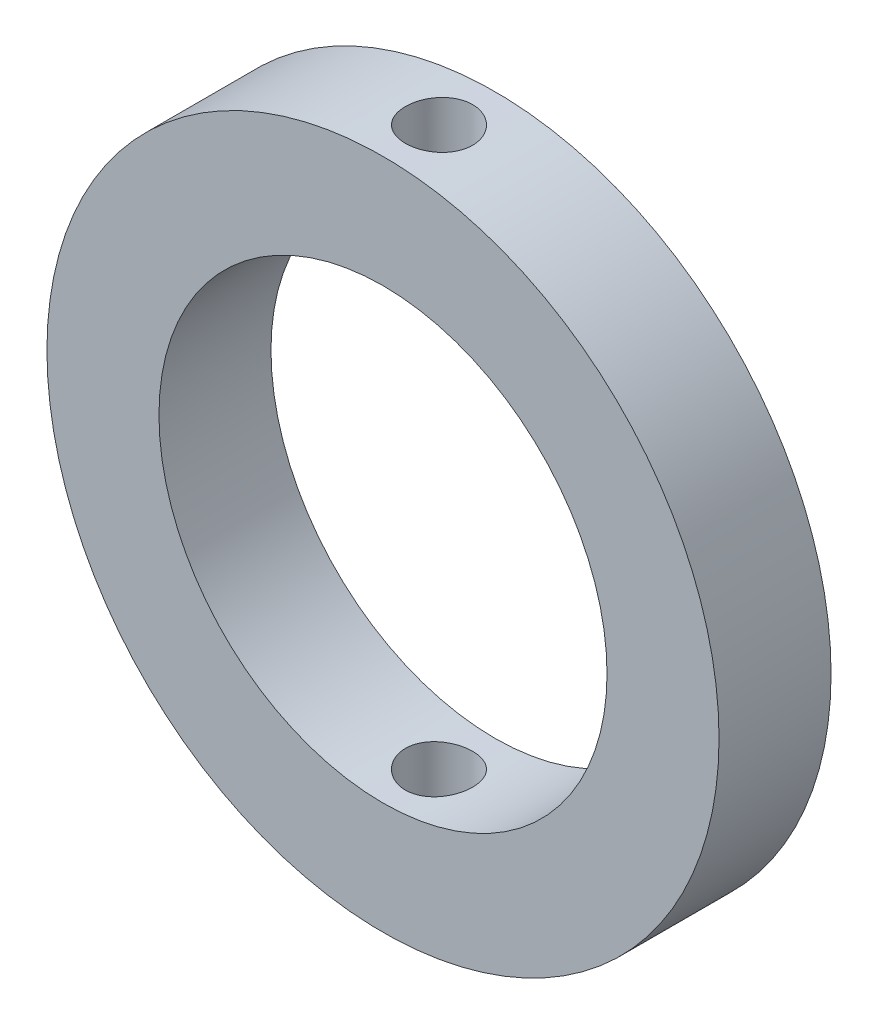
ISO-10303-21;
HEADER;
FILE_DESCRIPTION(('STEP AP214'),'2;1');
FILE_NAME('part.step','',(''),(''),'','','');
FILE_SCHEMA(('AUTOMOTIVE_DESIGN { 1 0 10303 214 1 1 1 1 }'));
ENDSEC;
DATA;
#1=APPLICATION_CONTEXT('core data for automotive mechanical design processes');
#2=APPLICATION_PROTOCOL_DEFINITION('international standard','automotive_design',2000,#1);
#3=PRODUCT_CONTEXT('',#1,'mechanical');
#4=PRODUCT('Part','Part','',(#3));
#5=PRODUCT_RELATED_PRODUCT_CATEGORY('part','',(#4));
#6=PRODUCT_DEFINITION_FORMATION('','',#4);
#7=PRODUCT_DEFINITION_CONTEXT('part definition',#1,'design');
#8=PRODUCT_DEFINITION('design','',#6,#7);
#9=PRODUCT_DEFINITION_SHAPE('','',#8);
#10=(LENGTH_UNIT() NAMED_UNIT(*) SI_UNIT(.MILLI.,.METRE.));
#11=(NAMED_UNIT(*) PLANE_ANGLE_UNIT() SI_UNIT($,.RADIAN.));
#12=(NAMED_UNIT(*) SI_UNIT($,.STERADIAN.) SOLID_ANGLE_UNIT());
#13=UNCERTAINTY_MEASURE_WITH_UNIT(LENGTH_MEASURE(1.E-05),#10,'distance_accuracy_value','');
#14=(GEOMETRIC_REPRESENTATION_CONTEXT(3) GLOBAL_UNCERTAINTY_ASSIGNED_CONTEXT((#13)) GLOBAL_UNIT_ASSIGNED_CONTEXT((#10,
#11,#12)) REPRESENTATION_CONTEXT('',''));
#15=CARTESIAN_POINT('',(0.,0.,0.));
#16=DIRECTION('',(0.,0.,1.));
#17=DIRECTION('',(1.,0.,0.));
#18=AXIS2_PLACEMENT_3D('',#15,#16,#17);
#19=CARTESIAN_POINT('',(2.2031431611579E-09,5.20104532775859E-08,6.74999818942977));
#20=DIRECTION('',(0.,0.,1.));
#21=DIRECTION('',(1.,0.,0.));
#22=AXIS2_PLACEMENT_3D('',#19,#20,#21);
#23=PLANE('',#22);
#24=CARTESIAN_POINT('',(2.2031431611579E-09,5.20104532775859E-08,6.74999818942977));
#25=DIRECTION('',(0.,0.,1.));
#26=DIRECTION('',(1.,0.,0.));
#27=AXIS2_PLACEMENT_3D('',#24,#25,#26);
#28=CIRCLE('',#27,10.5);
#29=CARTESIAN_POINT('',(10.5000000022031,5.20104532775859E-08,6.74999818942977));
#30=VERTEX_POINT('',#29);
#31=EDGE_CURVE('E10',#30,#30,#28,.T.);
#32=ORIENTED_EDGE('',*,*,#31,.T.);
#33=EDGE_LOOP('',(#32));
#34=FACE_BOUND('',#33,.T.);
#35=CARTESIAN_POINT('',(2.2031431611579E-09,5.20104532775859E-08,6.74999818942977));
#36=DIRECTION('',(0.,0.,1.));
#37=DIRECTION('',(1.,0.,0.));
#38=AXIS2_PLACEMENT_3D('',#35,#36,#37);
#39=CIRCLE('',#38,7.);
#40=CARTESIAN_POINT('',(7.00000000220314,5.20104532775859E-08,6.74999818942977));
#41=VERTEX_POINT('',#40);
#42=EDGE_CURVE('E62',#41,#41,#39,.T.);
#43=ORIENTED_EDGE('',*,*,#42,.F.);
#44=EDGE_LOOP('',(#43));
#45=FACE_BOUND('',#44,.T.);
#46=ADVANCED_FACE('F41',(#34,#45),#23,.T.);
#47=CARTESIAN_POINT('',(2.2031431611579E-09,5.20104532775859E-08,3.24999818942977));
#48=DIRECTION('',(0.,0.,1.));
#49=DIRECTION('',(1.,0.,0.));
#50=AXIS2_PLACEMENT_3D('',#47,#48,#49);
#51=PLANE('',#50);
#52=CARTESIAN_POINT('',(2.2031431611579E-09,5.20104532775859E-08,3.24999818942977));
#53=DIRECTION('',(0.,0.,1.));
#54=DIRECTION('',(1.,0.,0.));
#55=AXIS2_PLACEMENT_3D('',#52,#53,#54);
#56=CIRCLE('',#55,10.5);
#57=CARTESIAN_POINT('',(10.5000000022031,5.20104532775859E-08,3.24999818942977));
#58=VERTEX_POINT('',#57);
#59=EDGE_CURVE('E56',#58,#58,#56,.T.);
#60=ORIENTED_EDGE('',*,*,#59,.F.);
#61=EDGE_LOOP('',(#60));
#62=FACE_BOUND('',#61,.T.);
#63=CARTESIAN_POINT('',(2.2031431611579E-09,5.20104532775859E-08,3.24999818942977));
#64=DIRECTION('',(0.,0.,1.));
#65=DIRECTION('',(1.,0.,0.));
#66=AXIS2_PLACEMENT_3D('',#63,#64,#65);
#67=CIRCLE('',#66,7.);
#68=CARTESIAN_POINT('',(7.00000000220314,5.20104532775859E-08,3.24999818942977));
#69=VERTEX_POINT('',#68);
#70=EDGE_CURVE('E65',#69,#69,#67,.T.);
#71=ORIENTED_EDGE('',*,*,#70,.T.);
#72=EDGE_LOOP('',(#71));
#73=FACE_BOUND('',#72,.T.);
#74=ADVANCED_FACE('F106',(#62,#73),#51,.F.);
#75=CARTESIAN_POINT('',(2.2031431611579E-09,5.20104532775859E-08,6.74999818942977));
#76=DIRECTION('',(0.,0.,-1.));
#77=DIRECTION('',(-1.,0.,0.));
#78=AXIS2_PLACEMENT_3D('',#75,#76,#77);
#79=CYLINDRICAL_SURFACE('',#78,10.5);
#80=CARTESIAN_POINT('',(2.2031431611579E-09,-10.4999999479895,6.04999818942977));
#81=CARTESIAN_POINT('',(0.0588213736842783,-10.4999992709576,6.04999564223437));
#82=CARTESIAN_POINT('',(0.117681634629305,-10.4995004167497,6.0450387570885));
#83=CARTESIAN_POINT('',(0.233770320624822,-10.4975583577343,6.02533960062482));
#84=CARTESIAN_POINT('',(0.290996875330412,-10.4961141125468,6.01058654860395));
#85=CARTESIAN_POINT('',(0.402120261429228,-10.4924443009018,5.97172883680204));
#86=CARTESIAN_POINT('',(0.456019081048799,-10.490219206397,5.94762982488537));
#87=CARTESIAN_POINT('',(0.558994971211571,-10.4852365006298,5.89077523610154));
#88=CARTESIAN_POINT('',(0.608072997921174,-10.4824789952899,5.85802138062962));
#89=CARTESIAN_POINT('',(0.700202530410929,-10.4767292635734,5.78466035688438));
#90=CARTESIAN_POINT('',(0.74323425427978,-10.4737363145151,5.74402840005763));
#91=CARTESIAN_POINT('',(0.821879649705677,-10.4678589955053,5.65611742845359));
#92=CARTESIAN_POINT('',(0.857492978139929,-10.4649746305812,5.60883810638526));
#93=CARTESIAN_POINT('',(0.920360671168941,-10.4596336592938,5.50885073116197));
#94=CARTESIAN_POINT('',(0.947597140930767,-10.457177973454,5.45613137313017));
#95=CARTESIAN_POINT('',(0.992823706183041,-10.4529813422281,5.34683882422954));
#96=CARTESIAN_POINT('',(1.010814030124,-10.4512403791829,5.29026572861662));
#97=CARTESIAN_POINT('',(1.03697899588513,-10.4486768307558,5.17507329852046));
#98=CARTESIAN_POINT('',(1.04518643785713,-10.4478511771696,5.11646148373495));
#99=CARTESIAN_POINT('',(1.05165405159527,-10.4472022001251,4.9986868828642));
#100=CARTESIAN_POINT('',(1.04991448481748,-10.4473788503214,4.93952411130161));
#101=CARTESIAN_POINT('',(1.03656449646846,-10.4487117204284,4.82255311425178));
#102=CARTESIAN_POINT('',(1.02498988853392,-10.4498643861914,4.76474075513464));
#103=CARTESIAN_POINT('',(0.992354103561259,-10.4530138580074,4.65188332806862));
#104=CARTESIAN_POINT('',(0.971292798371677,-10.4550106754637,4.59683829751349));
#105=CARTESIAN_POINT('',(0.920241940778726,-10.4596275472363,4.49096492276594));
#106=CARTESIAN_POINT('',(0.890236499059121,-10.4622487090252,4.44014429046599));
#107=CARTESIAN_POINT('',(0.822160530924032,-10.4678179911848,4.34424671377229));
#108=CARTESIAN_POINT('',(0.784089768456474,-10.4707661211238,4.29916993754892));
#109=CARTESIAN_POINT('',(0.700763820235816,-10.4766729937759,4.21583152574129));
#110=CARTESIAN_POINT('',(0.655477704997074,-10.479631725986,4.17760080745492));
#111=CARTESIAN_POINT('',(0.559113958027111,-10.485214153314,4.10927937487386));
#112=CARTESIAN_POINT('',(0.508036319802724,-10.4878378480562,4.07918866970547));
#113=CARTESIAN_POINT('',(0.401518013180126,-10.4924554424941,4.028002668104));
#114=CARTESIAN_POINT('',(0.346076585912541,-10.4944492323446,4.0069089403708));
#115=CARTESIAN_POINT('',(0.232414580399572,-10.4975812461243,3.97433832688243));
#116=CARTESIAN_POINT('',(0.174194085318573,-10.4987194956387,3.96286115353962));
#117=CARTESIAN_POINT('',(0.0568943562496422,-10.5000088905068,3.94988866630827));
#118=CARTESIAN_POINT('',(-0.00218011500762314,-10.5001642548008,3.94835068876465));
#119=CARTESIAN_POINT('',(-0.119745980778341,-10.4994816864359,3.95518819563097));
#120=CARTESIAN_POINT('',(-0.17823738315835,-10.4986437671965,3.96356354611081));
#121=CARTESIAN_POINT('',(-0.292853614973265,-10.4960714941511,3.98995456962242));
#122=CARTESIAN_POINT('',(-0.348983089217477,-10.494338998129,4.00795026663168));
#123=CARTESIAN_POINT('',(-0.457426535249827,-10.4901719360259,4.0530506221689));
#124=CARTESIAN_POINT('',(-0.50974042146183,-10.4877373542047,4.08015548492114));
#125=CARTESIAN_POINT('',(-0.609260586977606,-10.482427938959,4.14281057002688));
#126=CARTESIAN_POINT('',(-0.65644914053322,-10.4795516558257,4.17838882280188));
#127=CARTESIAN_POINT('',(-0.744199702274329,-10.4736862431195,4.25694056055774));
#128=CARTESIAN_POINT('',(-0.784761544088493,-10.4706971107157,4.2999142311536));
#129=CARTESIAN_POINT('',(-0.85825541317836,-10.4649302014675,4.39222309282172));
#130=CARTESIAN_POINT('',(-0.891159440410377,-10.4621532244488,4.44158063379952));
#131=CARTESIAN_POINT('',(-0.948211169477875,-10.4571371888289,4.54514591758379));
#132=CARTESIAN_POINT('',(-0.972358991053433,-10.4548981228719,4.59935359405259));
#133=CARTESIAN_POINT('',(-1.01116596691556,-10.4512163981471,4.71098436586885));
#134=CARTESIAN_POINT('',(-1.02584178134931,-10.4497723417123,4.76840162152545));
#135=CARTESIAN_POINT('',(-1.04534220528279,-10.4478397834597,4.88490054728858));
#136=CARTESIAN_POINT('',(-1.05016709731635,-10.4473512542365,4.94398216961023));
#137=CARTESIAN_POINT('',(-1.04982479319168,-10.4473856356189,5.06185441220431));
#138=CARTESIAN_POINT('',(-1.04470158186962,-10.4479040939031,5.12064516645672));
#139=CARTESIAN_POINT('',(-1.02470072340869,-10.4498845388298,5.23652635245647));
#140=CARTESIAN_POINT('',(-1.00982306529712,-10.4513465265336,5.29361678229105));
#141=CARTESIAN_POINT('',(-0.970747768409235,-10.455048064753,5.40447640593002));
#142=CARTESIAN_POINT('',(-0.946551419354819,-10.4572875076633,5.45824605814098));
#143=CARTESIAN_POINT('',(-0.889530130453453,-10.4622918423028,5.56096792568435));
#144=CARTESIAN_POINT('',(-0.856705238925042,-10.4650567310895,5.60992016799143));
#145=CARTESIAN_POINT('',(-0.783193481896455,-10.4708150636914,5.7018430476253));
#146=CARTESIAN_POINT('',(-0.742473844131639,-10.4738094276204,5.74478741961521));
#147=CARTESIAN_POINT('',(-0.654393281983222,-10.4796809226418,5.82325303376441));
#148=CARTESIAN_POINT('',(-0.607030769110526,-10.4825580254808,5.8587724953548));
#149=CARTESIAN_POINT('',(-0.50687850366621,-10.4878783497157,5.92145031597712));
#150=CARTESIAN_POINT('',(-0.454075384610958,-10.4903204602711,5.94858739492221));
#151=CARTESIAN_POINT('',(-0.344671190852435,-10.4944835551135,5.99357373339483));
#152=CARTESIAN_POINT('',(-0.288074480113746,-10.4962053520409,6.01143346493099));
#153=CARTESIAN_POINT('',(-0.192631172272846,-10.4983011926137,6.03290483736881));
#154=CARTESIAN_POINT('',(-0.154394678283591,-10.4989352552538,6.0393060859441));
#155=CARTESIAN_POINT('',(-0.0774444076550355,-10.4997848549728,6.04785359179462));
#156=CARTESIAN_POINT('',(-0.0387306329847426,-10.5000003937778,6.04999986661772));
#157=CARTESIAN_POINT('',(2.2031431611579E-09,-10.4999999479895,6.04999818942977));
#158=B_SPLINE_CURVE_WITH_KNOTS('',3,(#80,#81,#82,#83,#84,#85,#86,#87,#88,#89,#90,#91,#92,#93,
#94,#95,#96,#97,#98,#99,#100,#101,#102,#103,#104,#105,#106,#107,#108,#109,#110,#111,#112,#113,
#114,#115,#116,#117,#118,#119,#120,#121,#122,#123,#124,#125,#126,#127,#128,#129,#130,#131,#132,
#133,#134,#135,#136,#137,#138,#139,#140,#141,#142,#143,#144,#145,#146,#147,#148,#149,#150,#151,
#152,#153,#154,#155,#156,#157),.UNSPECIFIED.,.T.,.F.,(4,2,2,2,2,2,2,2,2,2,2,2,2,2,2,2,2,2,2,2,2,
2,2,2,2,2,2,2,2,2,2,2,2,2,2,2,2,2,4),(0.,0.176322684581897,0.352839734977261,0.529250280018813,
0.705625764461921,0.882565497054092,1.05951341181741,1.23683674245833,1.41415569164629,
1.59087843647456,1.76759653618565,1.94367387313166,2.11975358869715,2.29614799441539,
2.47254756347682,2.64972470906017,2.8269020532876,3.0041102772826,3.18131320159211,
3.35775498038145,3.534194375451,3.7102688205902,3.8863472135194,4.06301637786133,
4.23968997700741,4.41699975789028,4.59430711399143,4.77130175122653,4.94829131201564,
5.12450010758654,5.30070910137341,5.4768937163094,5.65307734465908,5.83000863299036,
6.00698230268805,6.18440162577554,6.3616202453506,6.47771950593966,6.59381828772478),.UNSPECIFIED.);
#159=CARTESIAN_POINT('',(2.2031431611579E-09,-10.4999999479895,6.04999818942977));
#160=VERTEX_POINT('',#159);
#161=EDGE_CURVE('E92',#160,#160,#158,.T.);
#162=ORIENTED_EDGE('',*,*,#161,.T.);
#163=EDGE_LOOP('',(#162));
#164=FACE_BOUND('',#163,.T.);
#165=CARTESIAN_POINT('',(2.2031431611579E-09,10.5000000520105,6.04999818942977));
#166=CARTESIAN_POINT('',(-0.058821369277992,10.4999993749785,6.04999564223437));
#167=CARTESIAN_POINT('',(-0.117681630223019,10.4995005207706,6.0450387570885));
#168=CARTESIAN_POINT('',(-0.233770316218536,10.4975584617552,6.02533960062482));
#169=CARTESIAN_POINT('',(-0.290996870924126,10.4961142165677,6.01058654860395));
#170=CARTESIAN_POINT('',(-0.402120257022942,10.4924444049227,5.97172883680204));
#171=CARTESIAN_POINT('',(-0.456019076642512,10.4902193104179,5.94762982488537));
#172=CARTESIAN_POINT('',(-0.558994966805284,10.4852366046507,5.89077523610154));
#173=CARTESIAN_POINT('',(-0.608072993514887,10.4824790993108,5.85802138062962));
#174=CARTESIAN_POINT('',(-0.700202526004643,10.4767293675944,5.78466035688438));
#175=CARTESIAN_POINT('',(-0.743234249873494,10.473736418536,5.74402840005763));
#176=CARTESIAN_POINT('',(-0.82187964529939,10.4678590995262,5.65611742845359));
#177=CARTESIAN_POINT('',(-0.857492973733642,10.4649747346021,5.60883810638526));
#178=CARTESIAN_POINT('',(-0.920360666762654,10.4596337633147,5.50885073116197));
#179=CARTESIAN_POINT('',(-0.94759713652448,10.457178077475,5.45613137313017));
#180=CARTESIAN_POINT('',(-0.992823701776754,10.452981446249,5.34683882422954));
#181=CARTESIAN_POINT('',(-1.01081402571771,10.4512404832038,5.29026572861662));
#182=CARTESIAN_POINT('',(-1.03697899147884,10.4486769347767,5.17507329852046));
#183=CARTESIAN_POINT('',(-1.04518643345084,10.4478512811905,5.11646148373495));
#184=CARTESIAN_POINT('',(-1.05165404718899,10.447202304146,4.9986868828642));
#185=CARTESIAN_POINT('',(-1.0499144804112,10.4473789543423,4.93952411130161));
#186=CARTESIAN_POINT('',(-1.03656449206217,10.4487118244493,4.82255311425179));
#187=CARTESIAN_POINT('',(-1.02498988412764,10.4498644902123,4.76474075513464));
#188=CARTESIAN_POINT('',(-0.992354099154972,10.4530139620283,4.65188332806862));
#189=CARTESIAN_POINT('',(-0.97129279396539,10.4550107794846,4.59683829751349));
#190=CARTESIAN_POINT('',(-0.920241936372439,10.4596276512572,4.49096492276594));
#191=CARTESIAN_POINT('',(-0.890236494652835,10.4622488130461,4.44014429046599));
#192=CARTESIAN_POINT('',(-0.822160526517745,10.4678180952057,4.34424671377229));
#193=CARTESIAN_POINT('',(-0.784089764050187,10.4707662251447,4.29916993754892));
#194=CARTESIAN_POINT('',(-0.700763815829529,10.4766730977968,4.21583152574129));
#195=CARTESIAN_POINT('',(-0.655477700590788,10.4796318300069,4.17760080745492));
#196=CARTESIAN_POINT('',(-0.559113953620824,10.4852142573349,4.10927937487386));
#197=CARTESIAN_POINT('',(-0.508036315396437,10.4878379520771,4.07918866970547));
#198=CARTESIAN_POINT('',(-0.40151800877384,10.492455546515,4.028002668104));
#199=CARTESIAN_POINT('',(-0.346076581506255,10.4944493363655,4.0069089403708));
#200=CARTESIAN_POINT('',(-0.232414575993285,10.4975813501452,3.97433832688243));
#201=CARTESIAN_POINT('',(-0.174194080912287,10.4987195996596,3.96286115353962));
#202=CARTESIAN_POINT('',(-0.0568943518433558,10.5000089945277,3.94988866630827));
#203=CARTESIAN_POINT('',(0.00218011941390962,10.5001643588217,3.94835068876465));
#204=CARTESIAN_POINT('',(0.119745985184628,10.4994817904568,3.95518819563097));
#205=CARTESIAN_POINT('',(0.178237387564637,10.4986438712174,3.96356354611081));
#206=CARTESIAN_POINT('',(0.292853619379551,10.496071598172,3.98995456962242));
#207=CARTESIAN_POINT('',(0.348983093623763,10.4943391021499,4.00795026663168));
#208=CARTESIAN_POINT('',(0.457426539656114,10.4901720400468,4.0530506221689));
#209=CARTESIAN_POINT('',(0.509740425868116,10.4877374582256,4.08015548492114));
#210=CARTESIAN_POINT('',(0.609260591383892,10.4824280429799,4.14281057002688));
#211=CARTESIAN_POINT('',(0.656449144939506,10.4795517598466,4.17838882280188));
#212=CARTESIAN_POINT('',(0.744199706680615,10.4736863471404,4.25694056055774));
#213=CARTESIAN_POINT('',(0.784761548494779,10.4706972147367,4.2999142311536));
#214=CARTESIAN_POINT('',(0.858255417584646,10.4649303054884,4.39222309282172));
#215=CARTESIAN_POINT('',(0.891159444816663,10.4621533284697,4.44158063379952));
#216=CARTESIAN_POINT('',(0.948211173884162,10.4571372928498,4.54514591758379));
#217=CARTESIAN_POINT('',(0.972358995459719,10.4548982268928,4.59935359405259));
#218=CARTESIAN_POINT('',(1.01116597132184,10.451216502168,4.71098436586885));
#219=CARTESIAN_POINT('',(1.0258417857556,10.4497724457332,4.76840162152545));
#220=CARTESIAN_POINT('',(1.04534220968908,10.4478398874807,4.88490054728858));
#221=CARTESIAN_POINT('',(1.05016710172264,10.4473513582574,4.94398216961023));
#222=CARTESIAN_POINT('',(1.04982479759796,10.4473857396399,5.06185441220431));
#223=CARTESIAN_POINT('',(1.04470158627591,10.447904197924,5.12064516645672));
#224=CARTESIAN_POINT('',(1.02470072781498,10.4498846428507,5.23652635245647));
#225=CARTESIAN_POINT('',(1.00982306970341,10.4513466305545,5.29361678229105));
#226=CARTESIAN_POINT('',(0.970747772815521,10.4550481687739,5.40447640593002));
#227=CARTESIAN_POINT('',(0.946551423761105,10.4572876116842,5.45824605814098));
#228=CARTESIAN_POINT('',(0.88953013485974,10.4622919463237,5.56096792568435));
#229=CARTESIAN_POINT('',(0.856705243331329,10.4650568351104,5.60992016799143));
#230=CARTESIAN_POINT('',(0.783193486302741,10.4708151677123,5.7018430476253));
#231=CARTESIAN_POINT('',(0.742473848537925,10.4738095316413,5.74478741961521));
#232=CARTESIAN_POINT('',(0.654393286389508,10.4796810266627,5.82325303376441));
#233=CARTESIAN_POINT('',(0.607030773516813,10.4825581295017,5.8587724953548));
#234=CARTESIAN_POINT('',(0.506878508072497,10.4878784537366,5.92145031597712));
#235=CARTESIAN_POINT('',(0.454075389017245,10.490320564292,5.94858739492221));
#236=CARTESIAN_POINT('',(0.344671195258721,10.4944836591344,5.99357373339483));
#237=CARTESIAN_POINT('',(0.288074484520033,10.4962054560618,6.01143346493099));
#238=CARTESIAN_POINT('',(0.192631176679133,10.4983012966347,6.03290483736881));
#239=CARTESIAN_POINT('',(0.154394682689877,10.4989353592747,6.0393060859441));
#240=CARTESIAN_POINT('',(0.0774444120613218,10.4997849589937,6.04785359179462));
#241=CARTESIAN_POINT('',(0.0387306373910289,10.5000004977987,6.04999986661772));
#242=CARTESIAN_POINT('',(2.2031431611579E-09,10.5000000520105,6.04999818942977));
#243=B_SPLINE_CURVE_WITH_KNOTS('',3,(#165,#166,#167,#168,#169,#170,#171,#172,#173,#174,#175,
#176,#177,#178,#179,#180,#181,#182,#183,#184,#185,#186,#187,#188,#189,#190,#191,#192,#193,#194,
#195,#196,#197,#198,#199,#200,#201,#202,#203,#204,#205,#206,#207,#208,#209,#210,#211,#212,#213,
#214,#215,#216,#217,#218,#219,#220,#221,#222,#223,#224,#225,#226,#227,#228,#229,#230,#231,#232,
#233,#234,#235,#236,#237,#238,#239,#240,#241,#242),.UNSPECIFIED.,.T.,.F.,(4,2,2,2,2,2,2,2,2,2,2,
2,2,2,2,2,2,2,2,2,2,2,2,2,2,2,2,2,2,2,2,2,2,2,2,2,2,2,4),(0.,0.176322684581897,
0.352839734977261,0.529250280018813,0.705625764461921,0.882565497054092,1.05951341181741,
1.23683674245833,1.41415569164629,1.59087843647456,1.76759653618565,1.94367387313166,
2.11975358869715,2.29614799441539,2.47254756347682,2.64972470906017,2.8269020532876,
3.0041102772826,3.18131320159211,3.35775498038145,3.534194375451,3.7102688205902,
3.8863472135194,4.06301637786133,4.23968997700741,4.41699975789028,4.59430711399143,
4.77130175122653,4.94829131201564,5.12450010758654,5.30070910137341,5.4768937163094,
5.65307734465908,5.83000863299036,6.00698230268805,6.18440162577554,6.3616202453506,
6.47771950593966,6.59381828772478),.UNSPECIFIED.);
#244=CARTESIAN_POINT('',(2.2031431611579E-09,10.5000000520105,6.04999818942977));
#245=VERTEX_POINT('',#244);
#246=EDGE_CURVE('E86',#245,#245,#243,.T.);
#247=ORIENTED_EDGE('',*,*,#246,.T.);
#248=EDGE_LOOP('',(#247));
#249=FACE_BOUND('',#248,.T.);
#250=ORIENTED_EDGE('',*,*,#31,.F.);
#251=EDGE_LOOP('',(#250));
#252=FACE_BOUND('',#251,.T.);
#253=ORIENTED_EDGE('',*,*,#59,.T.);
#254=EDGE_LOOP('',(#253));
#255=FACE_BOUND('',#254,.T.);
#256=ADVANCED_FACE('F43',(#164,#249,#252,#255),#79,.T.);
#257=CARTESIAN_POINT('',(2.2031431611579E-09,5.20104532775859E-08,6.74999818942977));
#258=DIRECTION('',(0.,0.,-1.));
#259=DIRECTION('',(-1.,0.,0.));
#260=AXIS2_PLACEMENT_3D('',#257,#258,#259);
#261=CYLINDRICAL_SURFACE('',#260,7.);
#262=CARTESIAN_POINT('',(2.2031431611579E-09,-6.99999994798955,6.04999818942977));
#263=CARTESIAN_POINT('',(0.0586260833402927,-6.99999900838863,6.0499957717591));
#264=CARTESIAN_POINT('',(0.117286181760636,-6.99925572574883,6.04507158884133));
#265=CARTESIAN_POINT('',(0.232966741799582,-6.99636215980185,6.02550994944184));
#266=CARTESIAN_POINT('',(0.289985550485103,-6.99421050655886,6.01086303536834));
#267=CARTESIAN_POINT('',(0.400692662558445,-6.98874199652622,5.97230343595243));
#268=CARTESIAN_POINT('',(0.454383447681903,-6.98542602058598,5.9483977537756));
#269=CARTESIAN_POINT('',(0.556983302247821,-6.97799527937161,5.89201632383797));
#270=CARTESIAN_POINT('',(0.605893034510775,-6.97388062505896,5.85954176633762));
#271=CARTESIAN_POINT('',(0.697932705896631,-6.96527414492971,5.78667410397186));
#272=CARTESIAN_POINT('',(0.741019884760993,-6.96077988522186,5.74622727008403));
#273=CARTESIAN_POINT('',(0.819822436885782,-6.95193977592221,5.65867880720406));
#274=CARTESIAN_POINT('',(0.855537386113693,-6.94759393487908,5.6115767956848));
#275=CARTESIAN_POINT('',(0.918748108702743,-6.93951909020063,5.51176773896402));
#276=CARTESIAN_POINT('',(0.946202511463578,-6.93579323181476,5.45903421654283));
#277=CARTESIAN_POINT('',(0.991848427400536,-6.92941342713342,5.34963921497797));
#278=CARTESIAN_POINT('',(1.01004044542728,-6.92675942241769,5.29297795010905));
#279=CARTESIAN_POINT('',(1.03651239379552,-6.92284774152026,5.17778556011957));
#280=CARTESIAN_POINT('',(1.04486552768677,-6.9215797581783,5.11927161404415));
#281=CARTESIAN_POINT('',(1.05164937044067,-6.92055239078362,5.00165987323867));
#282=CARTESIAN_POINT('',(1.05008064901972,-6.92079292011158,4.94256211222602));
#283=CARTESIAN_POINT('',(1.03712513495866,-6.92274597645641,4.82597743329387));
#284=CARTESIAN_POINT('',(1.0258198736974,-6.92444627932039,4.76848122089041));
#285=CARTESIAN_POINT('',(0.993839824029282,-6.92910820487412,4.6562111312197));
#286=CARTESIAN_POINT('',(0.973164770567827,-6.9320698632452,4.60143733101325));
#287=CARTESIAN_POINT('',(0.922947226911298,-6.93893429680791,4.49591882953177));
#288=CARTESIAN_POINT('',(0.893370202185527,-6.94284072535523,4.4451908110651));
#289=CARTESIAN_POINT('',(0.826212894105826,-6.95115190101138,4.34938697238242));
#290=CARTESIAN_POINT('',(0.78863208548049,-6.95555668081705,4.30431152344121));
#291=CARTESIAN_POINT('',(0.706086453750877,-6.96442225938301,4.22061982691197));
#292=CARTESIAN_POINT('',(0.661051532952544,-6.96888317777925,4.18207269622933));
#293=CARTESIAN_POINT('',(0.565114965129073,-6.97731748152878,4.11307303527469));
#294=CARTESIAN_POINT('',(0.514213292414862,-6.98129086474712,4.08262054044904));
#295=CARTESIAN_POINT('',(0.407928220952723,-6.9883065570873,4.03067102888009));
#296=CARTESIAN_POINT('',(0.352542176688889,-6.99134831146754,4.00917934514156));
#297=CARTESIAN_POINT('',(0.238891229944085,-6.99615338188903,3.97582161665001));
#298=CARTESIAN_POINT('',(0.180626522369963,-6.99791678435782,3.96395492115887));
#299=CARTESIAN_POINT('',(0.0634686995536954,-6.99995501592664,3.95027592855808));
#300=CARTESIAN_POINT('',(0.00458691451247212,-7.00024391262226,3.94836860946424));
#301=CARTESIAN_POINT('',(-0.112655672160455,-6.99933887509613,3.95441029314749));
#302=CARTESIAN_POINT('',(-0.171016489864171,-6.99814498677912,3.96235899079744));
#303=CARTESIAN_POINT('',(-0.285272668998842,-6.99441722829688,3.98780805955405));
#304=CARTESIAN_POINT('',(-0.341178571952743,-6.99188985444544,4.00526213665136));
#305=CARTESIAN_POINT('',(-0.449270468846956,-6.98577759759813,4.049177687653));
#306=CARTESIAN_POINT('',(-0.501456287953427,-6.9821926649405,4.07563958456331));
#307=CARTESIAN_POINT('',(-0.601044483301201,-6.97432872527035,4.13704254662447));
#308=CARTESIAN_POINT('',(-0.648409304720952,-6.97004485937676,4.17204388743871));
#309=CARTESIAN_POINT('',(-0.73662656902125,-6.9612749890747,4.24944825756989));
#310=CARTESIAN_POINT('',(-0.777478633152239,-6.95678897292962,4.29185171705702));
#311=CARTESIAN_POINT('',(-0.851856492497225,-6.948075798121,4.38327966265331));
#312=CARTESIAN_POINT('',(-0.885318591028804,-6.94385110011266,4.43235623706611));
#313=CARTESIAN_POINT('',(-0.943523902690945,-6.93618248172387,4.53548941778801));
#314=CARTESIAN_POINT('',(-0.968267351391907,-6.93273854024894,4.5895458894948));
#315=CARTESIAN_POINT('',(-1.00823426906446,-6.92703917905006,4.70091446296596));
#316=CARTESIAN_POINT('',(-1.0234912577883,-6.92477957903461,4.75821431210964));
#317=CARTESIAN_POINT('',(-1.04415884430796,-6.92169362407416,4.87459950023434));
#318=CARTESIAN_POINT('',(-1.04957012207832,-6.92086717015194,4.93368471562604));
#319=CARTESIAN_POINT('',(-1.05037650448294,-6.92074477626544,5.05132853375082));
#320=CARTESIAN_POINT('',(-1.04587176296805,-6.92143353232406,5.10988645865961));
#321=CARTESIAN_POINT('',(-1.02718860460751,-6.92423069226776,5.22540187375623));
#322=CARTESIAN_POINT('',(-1.01301020326725,-6.92633909387737,5.28235936650914));
#323=CARTESIAN_POINT('',(-0.975417612427512,-6.93173263077563,5.3930293469938));
#324=CARTESIAN_POINT('',(-0.952010423067054,-6.93501687400207,5.44674425873318));
#325=CARTESIAN_POINT('',(-0.896634671293019,-6.94239312989346,5.54950073309145));
#326=CARTESIAN_POINT('',(-0.864665818987369,-6.94648516990861,5.59854213739232));
#327=CARTESIAN_POINT('',(-0.792710361411005,-6.95506515154411,5.69106833001239));
#328=CARTESIAN_POINT('',(-0.752649581075496,-6.95955652316331,5.73449512270272));
#329=CARTESIAN_POINT('',(-0.665804186554841,-6.968400469776,5.81404537778125));
#330=CARTESIAN_POINT('',(-0.619018011642515,-6.97275301226486,5.85016714023308));
#331=CARTESIAN_POINT('',(-0.519746993077461,-6.98085624852319,5.91425956305492));
#332=CARTESIAN_POINT('',(-0.467232201532188,-6.98460349789129,5.94218426588009));
#333=CARTESIAN_POINT('',(-0.35822630697096,-6.99104014961026,5.9887751511604));
#334=CARTESIAN_POINT('',(-0.301739391764549,-6.99373064694984,6.00745092246735));
#335=CARTESIAN_POINT('',(-0.204166007319387,-6.99713652282008,6.03077712932684));
#336=CARTESIAN_POINT('',(-0.163681791243551,-6.99820479224644,6.03797401050694));
#337=CARTESIAN_POINT('',(-0.0821372779169443,-6.99963682962481,6.04758535782862));
#338=CARTESIAN_POINT('',(-0.0410769878309488,-7.00000060633097,6.04999988339655));
#339=CARTESIAN_POINT('',(2.2031431611579E-09,-6.99999994798955,6.04999818942977));
#340=B_SPLINE_CURVE_WITH_KNOTS('',3,(#262,#263,#264,#265,#266,#267,#268,#269,#270,#271,#272,
#273,#274,#275,#276,#277,#278,#279,#280,#281,#282,#283,#284,#285,#286,#287,#288,#289,#290,#291,
#292,#293,#294,#295,#296,#297,#298,#299,#300,#301,#302,#303,#304,#305,#306,#307,#308,#309,#310,
#311,#312,#313,#314,#315,#316,#317,#318,#319,#320,#321,#322,#323,#324,#325,#326,#327,#328,#329,
#330,#331,#332,#333,#334,#335,#336,#337,#338,#339),.UNSPECIFIED.,.T.,.F.,(4,2,2,2,2,2,2,2,2,2,2,
2,2,2,2,2,2,2,2,2,2,2,2,2,2,2,2,2,2,2,2,2,2,2,2,2,2,2,4),(0.,0.175728143522164,
0.351627474050406,0.527394016508266,0.703136156938319,0.880105912957903,1.05708584500806,
1.23493791676762,1.41278029357854,1.58929095224147,1.76579147569288,1.94082824037022,
2.11586995683253,2.29159968433311,2.46734094815974,2.64484003878786,2.82233990667068,
2.99994526289412,3.17753861035381,3.35343440980979,3.52932476393808,3.70436604276163,
3.87941554263391,4.05573831625835,4.23207134020041,4.4098695660927,4.58766298766182,
4.76482456420017,4.94197390496023,5.11734221782745,5.29271024960695,5.46794551788903,
5.64318672026815,5.82011380976004,5.99708202428113,6.17502426369313,6.35278163283009,
6.47590896385166,6.59903476486303),.UNSPECIFIED.);
#341=CARTESIAN_POINT('',(2.2031431611579E-09,-6.99999994798955,6.04999818942977));
#342=VERTEX_POINT('',#341);
#343=EDGE_CURVE('E46',#342,#342,#340,.T.);
#344=ORIENTED_EDGE('',*,*,#343,.F.);
#345=EDGE_LOOP('',(#344));
#346=FACE_BOUND('',#345,.T.);
#347=CARTESIAN_POINT('',(2.2031431611579E-09,7.00000005201045,6.04999818942977));
#348=CARTESIAN_POINT('',(-0.0586260789340064,6.99999911240953,6.0499957717591));
#349=CARTESIAN_POINT('',(-0.117286177354349,6.99925582976973,6.04507158884133));
#350=CARTESIAN_POINT('',(-0.232966737393296,6.99636226382276,6.02550994944184));
#351=CARTESIAN_POINT('',(-0.289985546078817,6.99421061057976,6.01086303536834));
#352=CARTESIAN_POINT('',(-0.400692658152159,6.98874210054713,5.97230343595243));
#353=CARTESIAN_POINT('',(-0.454383443275616,6.98542612460689,5.9483977537756));
#354=CARTESIAN_POINT('',(-0.556983297841535,6.97799538339252,5.89201632383797));
#355=CARTESIAN_POINT('',(-0.605893030104489,6.97388072907986,5.85954176633762));
#356=CARTESIAN_POINT('',(-0.697932701490345,6.96527424895062,5.78667410397186));
#357=CARTESIAN_POINT('',(-0.741019880354708,6.96077998924277,5.74622727008403));
#358=CARTESIAN_POINT('',(-0.819822432479497,6.95193987994312,5.65867880720406));
#359=CARTESIAN_POINT('',(-0.855537381707406,6.94759403889999,5.6115767956848));
#360=CARTESIAN_POINT('',(-0.918748104296456,6.93951919422153,5.51176773896402));
#361=CARTESIAN_POINT('',(-0.946202507057291,6.93579333583567,5.45903421654283));
#362=CARTESIAN_POINT('',(-0.991848422994249,6.92941353115433,5.34963921497797));
#363=CARTESIAN_POINT('',(-1.010040441021,6.92675952643859,5.29297795010905));
#364=CARTESIAN_POINT('',(-1.03651238938923,6.92284784554117,5.17778556011957));
#365=CARTESIAN_POINT('',(-1.04486552328048,6.9215798621992,5.11927161404415));
#366=CARTESIAN_POINT('',(-1.05164936603438,6.92055249480453,5.00165987323867));
#367=CARTESIAN_POINT('',(-1.05008064461343,6.92079302413248,4.94256211222602));
#368=CARTESIAN_POINT('',(-1.03712513055237,6.92274608047732,4.82597743329387));
#369=CARTESIAN_POINT('',(-1.02581986929111,6.9244463833413,4.76848122089041));
#370=CARTESIAN_POINT('',(-0.993839819622996,6.92910830889502,4.6562111312197));
#371=CARTESIAN_POINT('',(-0.973164766161541,6.93206996726611,4.60143733101325));
#372=CARTESIAN_POINT('',(-0.922947222505012,6.93893440082882,4.49591882953177));
#373=CARTESIAN_POINT('',(-0.893370197779241,6.94284082937614,4.4451908110651));
#374=CARTESIAN_POINT('',(-0.82621288969954,6.95115200503229,4.34938697238242));
#375=CARTESIAN_POINT('',(-0.788632081074204,6.95555678483796,4.30431152344121));
#376=CARTESIAN_POINT('',(-0.706086449344591,6.96442236340392,4.22061982691197));
#377=CARTESIAN_POINT('',(-0.661051528546258,6.96888328180015,4.18207269622933));
#378=CARTESIAN_POINT('',(-0.565114960722787,6.97731758554968,4.11307303527469));
#379=CARTESIAN_POINT('',(-0.514213288008576,6.98129096876802,4.08262054044904));
#380=CARTESIAN_POINT('',(-0.407928216546437,6.9883066611082,4.03067102888009));
#381=CARTESIAN_POINT('',(-0.352542172282603,6.99134841548845,4.00917934514156));
#382=CARTESIAN_POINT('',(-0.238891225537799,6.99615348590994,3.97582161665001));
#383=CARTESIAN_POINT('',(-0.180626517963677,6.99791688837872,3.96395492115887));
#384=CARTESIAN_POINT('',(-0.0634686951474092,6.99995511994755,3.95027592855808));
#385=CARTESIAN_POINT('',(-0.00458691010618608,7.00024401664317,3.94836860946424));
#386=CARTESIAN_POINT('',(0.112655676566741,6.99933897911704,3.95441029314749));
#387=CARTESIAN_POINT('',(0.171016494270457,6.99814509080003,3.96235899079744));
#388=CARTESIAN_POINT('',(0.285272673405129,6.99441733231779,3.98780805955405));
#389=CARTESIAN_POINT('',(0.34117857635903,6.99188995846634,4.00526213665136));
#390=CARTESIAN_POINT('',(0.449270473253243,6.98577770161904,4.049177687653));
#391=CARTESIAN_POINT('',(0.501456292359713,6.98219276896141,4.07563958456331));
#392=CARTESIAN_POINT('',(0.601044487707488,6.97432882929126,4.13704254662447));
#393=CARTESIAN_POINT('',(0.648409309127239,6.97004496339767,4.17204388743871));
#394=CARTESIAN_POINT('',(0.736626573427537,6.96127509309561,4.24944825756989));
#395=CARTESIAN_POINT('',(0.777478637558525,6.95678907695052,4.29185171705702));
#396=CARTESIAN_POINT('',(0.851856496903511,6.94807590214191,4.38327966265331));
#397=CARTESIAN_POINT('',(0.88531859543509,6.94385120413357,4.43235623706611));
#398=CARTESIAN_POINT('',(0.943523907097231,6.93618258574478,4.53548941778801));
#399=CARTESIAN_POINT('',(0.968267355798194,6.93273864426985,4.5895458894948));
#400=CARTESIAN_POINT('',(1.00823427347075,6.92703928307097,4.70091446296596));
#401=CARTESIAN_POINT('',(1.02349126219459,6.92477968305552,4.75821431210964));
#402=CARTESIAN_POINT('',(1.04415884871425,6.92169372809507,4.87459950023434));
#403=CARTESIAN_POINT('',(1.04957012648461,6.92086727417285,4.93368471562604));
#404=CARTESIAN_POINT('',(1.05037650888922,6.92074488028634,5.05132853375082));
#405=CARTESIAN_POINT('',(1.04587176737433,6.92143363634497,5.10988645865961));
#406=CARTESIAN_POINT('',(1.02718860901379,6.92423079628867,5.22540187375623));
#407=CARTESIAN_POINT('',(1.01301020767353,6.92633919789828,5.28235936650914));
#408=CARTESIAN_POINT('',(0.975417616833798,6.93173273479653,5.3930293469938));
#409=CARTESIAN_POINT('',(0.952010427473341,6.93501697802298,5.44674425873318));
#410=CARTESIAN_POINT('',(0.896634675699305,6.94239323391436,5.54950073309145));
#411=CARTESIAN_POINT('',(0.864665823393656,6.94648527392952,5.59854213739232));
#412=CARTESIAN_POINT('',(0.792710365817291,6.95506525556502,5.69106833001239));
#413=CARTESIAN_POINT('',(0.752649585481783,6.95955662718422,5.73449512270272));
#414=CARTESIAN_POINT('',(0.665804190961127,6.96840057379691,5.81404537778125));
#415=CARTESIAN_POINT('',(0.619018016048801,6.97275311628576,5.85016714023308));
#416=CARTESIAN_POINT('',(0.519746997483748,6.9808563525441,5.91425956305492));
#417=CARTESIAN_POINT('',(0.467232205938475,6.98460360191219,5.94218426588009));
#418=CARTESIAN_POINT('',(0.358226311377246,6.99104025363117,5.9887751511604));
#419=CARTESIAN_POINT('',(0.301739396170835,6.99373075097075,6.00745092246735));
#420=CARTESIAN_POINT('',(0.204166011725673,6.99713662684099,6.03077712932684));
#421=CARTESIAN_POINT('',(0.163681795649838,6.99820489626735,6.03797401050694));
#422=CARTESIAN_POINT('',(0.0821372823232306,6.99963693364572,6.04758535782862));
#423=CARTESIAN_POINT('',(0.0410769922372351,7.00000071035188,6.04999988339655));
#424=CARTESIAN_POINT('',(2.2031431611579E-09,7.00000005201045,6.04999818942977));
#425=B_SPLINE_CURVE_WITH_KNOTS('',3,(#347,#348,#349,#350,#351,#352,#353,#354,#355,#356,#357,
#358,#359,#360,#361,#362,#363,#364,#365,#366,#367,#368,#369,#370,#371,#372,#373,#374,#375,#376,
#377,#378,#379,#380,#381,#382,#383,#384,#385,#386,#387,#388,#389,#390,#391,#392,#393,#394,#395,
#396,#397,#398,#399,#400,#401,#402,#403,#404,#405,#406,#407,#408,#409,#410,#411,#412,#413,#414,
#415,#416,#417,#418,#419,#420,#421,#422,#423,#424),.UNSPECIFIED.,.T.,.F.,(4,2,2,2,2,2,2,2,2,2,2,
2,2,2,2,2,2,2,2,2,2,2,2,2,2,2,2,2,2,2,2,2,2,2,2,2,2,2,4),(0.,0.175728143522164,
0.351627474050406,0.527394016508266,0.703136156938319,0.880105912957904,1.05708584500806,
1.23493791676762,1.41278029357854,1.58929095224147,1.76579147569288,1.94082824037022,
2.11586995683253,2.29159968433311,2.46734094815974,2.64484003878786,2.82233990667068,
2.99994526289412,3.17753861035381,3.35343440980979,3.52932476393808,3.70436604276164,
3.87941554263391,4.05573831625835,4.23207134020041,4.4098695660927,4.58766298766182,
4.76482456420017,4.94197390496023,5.11734221782745,5.29271024960694,5.46794551788902,
5.64318672026815,5.82011380976004,5.99708202428113,6.17502426369313,6.35278163283009,
6.47590896385166,6.59903476486303),.UNSPECIFIED.);
#426=CARTESIAN_POINT('',(2.2031431611579E-09,7.00000005201045,6.04999818942977));
#427=VERTEX_POINT('',#426);
#428=EDGE_CURVE('E67',#427,#427,#425,.T.);
#429=ORIENTED_EDGE('',*,*,#428,.F.);
#430=EDGE_LOOP('',(#429));
#431=FACE_BOUND('',#430,.T.);
#432=ORIENTED_EDGE('',*,*,#42,.T.);
#433=EDGE_LOOP('',(#432));
#434=FACE_BOUND('',#433,.T.);
#435=ORIENTED_EDGE('',*,*,#70,.F.);
#436=EDGE_LOOP('',(#435));
#437=FACE_BOUND('',#436,.T.);
#438=ADVANCED_FACE('F73',(#346,#431,#434,#437),#261,.F.);
#439=CARTESIAN_POINT('',(2.2031431611579E-09,-10.4999999479895,4.99999818942977));
#440=DIRECTION('',(0.,1.,0.));
#441=DIRECTION('',(0.,0.,1.));
#442=AXIS2_PLACEMENT_3D('',#439,#440,#441);
#443=CYLINDRICAL_SURFACE('',#442,1.05);
#444=ORIENTED_EDGE('',*,*,#428,.T.);
#445=EDGE_LOOP('',(#444));
#446=FACE_BOUND('',#445,.T.);
#447=ORIENTED_EDGE('',*,*,#246,.F.);
#448=EDGE_LOOP('',(#447));
#449=FACE_BOUND('',#448,.T.);
#450=ADVANCED_FACE('F79',(#446,#449),#443,.F.);
#451=ORIENTED_EDGE('',*,*,#343,.T.);
#452=EDGE_LOOP('',(#451));
#453=FACE_BOUND('',#452,.T.);
#454=ORIENTED_EDGE('',*,*,#161,.F.);
#455=EDGE_LOOP('',(#454));
#456=FACE_BOUND('',#455,.T.);
#457=ADVANCED_FACE('F76',(#453,#456),#443,.F.);
#458=CLOSED_SHELL('',(#46,#74,#256,#438,#450,#457));
#459=MANIFOLD_SOLID_BREP('B2',#458);
#460=ADVANCED_BREP_SHAPE_REPRESENTATION('',(#18,#459),#14);
#461=SHAPE_DEFINITION_REPRESENTATION(#9,#460);
ENDSEC;
END-ISO-10303-21;
